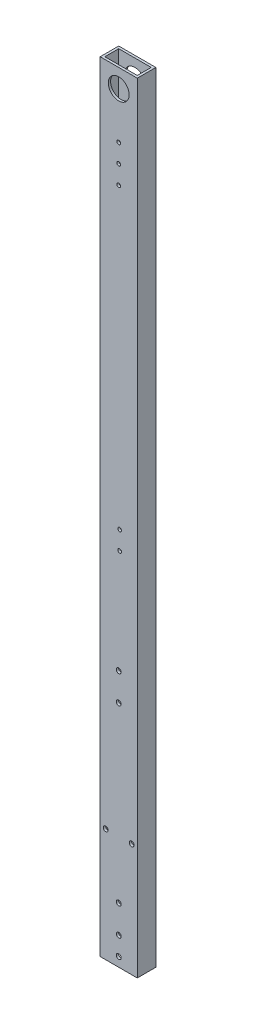
ISO-10303-21;
HEADER;
FILE_DESCRIPTION(('STEP AP214'),'2;1');
FILE_NAME('part.step','',(''),(''),'','','');
FILE_SCHEMA(('AUTOMOTIVE_DESIGN { 1 0 10303 214 1 1 1 1 }'));
ENDSEC;
DATA;
#1=APPLICATION_CONTEXT('core data for automotive mechanical design processes');
#2=APPLICATION_PROTOCOL_DEFINITION('international standard','automotive_design',2000,#1);
#3=PRODUCT_CONTEXT('',#1,'mechanical');
#4=PRODUCT('Part','Part','',(#3));
#5=PRODUCT_RELATED_PRODUCT_CATEGORY('part','',(#4));
#6=PRODUCT_DEFINITION_FORMATION('','',#4);
#7=PRODUCT_DEFINITION_CONTEXT('part definition',#1,'design');
#8=PRODUCT_DEFINITION('design','',#6,#7);
#9=PRODUCT_DEFINITION_SHAPE('','',#8);
#10=(LENGTH_UNIT() NAMED_UNIT(*) SI_UNIT(.MILLI.,.METRE.));
#11=(NAMED_UNIT(*) PLANE_ANGLE_UNIT() SI_UNIT($,.RADIAN.));
#12=(NAMED_UNIT(*) SI_UNIT($,.STERADIAN.) SOLID_ANGLE_UNIT());
#13=UNCERTAINTY_MEASURE_WITH_UNIT(LENGTH_MEASURE(1.E-05),#10,'distance_accuracy_value','');
#14=(GEOMETRIC_REPRESENTATION_CONTEXT(3) GLOBAL_UNCERTAINTY_ASSIGNED_CONTEXT((#13)) GLOBAL_UNIT_ASSIGNED_CONTEXT((#10,
#11,#12)) REPRESENTATION_CONTEXT('',''));
#15=CARTESIAN_POINT('',(0.,0.,0.));
#16=DIRECTION('',(0.,0.,1.));
#17=DIRECTION('',(1.,0.,0.));
#18=AXIS2_PLACEMENT_3D('',#15,#16,#17);
#19=CARTESIAN_POINT('',(0.,1066.8,0.));
#20=DIRECTION('',(0.,-1.,0.));
#21=DIRECTION('',(0.,0.,-1.));
#22=AXIS2_PLACEMENT_3D('',#19,#20,#21);
#23=PLANE('',#22);
#24=DIRECTION('',(0.,0.,-1.));
#25=VECTOR('',#24,1.);
#26=CARTESIAN_POINT('',(25.4,1066.8,12.7));
#27=LINE('',#26,#25);
#28=CARTESIAN_POINT('',(25.4,1066.8,12.7));
#29=VERTEX_POINT('',#28);
#30=CARTESIAN_POINT('',(25.4,1066.8,-12.7));
#31=VERTEX_POINT('',#30);
#32=EDGE_CURVE('E137',#29,#31,#27,.T.);
#33=ORIENTED_EDGE('',*,*,#32,.T.);
#34=DIRECTION('',(-1.,0.,0.));
#35=VECTOR('',#34,1.);
#36=CARTESIAN_POINT('',(-25.4,1066.8,-12.7));
#37=LINE('',#36,#35);
#38=CARTESIAN_POINT('',(-25.4,1066.8,-12.7));
#39=VERTEX_POINT('',#38);
#40=EDGE_CURVE('E140',#31,#39,#37,.T.);
#41=ORIENTED_EDGE('',*,*,#40,.T.);
#42=DIRECTION('',(0.,0.,1.));
#43=VECTOR('',#42,1.);
#44=CARTESIAN_POINT('',(-25.4,1066.8,12.7));
#45=LINE('',#44,#43);
#46=CARTESIAN_POINT('',(-25.4,1066.8,12.7));
#47=VERTEX_POINT('',#46);
#48=EDGE_CURVE('E143',#39,#47,#45,.T.);
#49=ORIENTED_EDGE('',*,*,#48,.T.);
#50=DIRECTION('',(1.,0.,0.));
#51=VECTOR('',#50,1.);
#52=CARTESIAN_POINT('',(-25.4,1066.8,12.7));
#53=LINE('',#52,#51);
#54=EDGE_CURVE('E145',#47,#29,#53,.T.);
#55=ORIENTED_EDGE('',*,*,#54,.T.);
#56=EDGE_LOOP('',(#33,#41,#49,#55));
#57=FACE_BOUND('',#56,.T.);
#58=DIRECTION('',(0.,0.,1.));
#59=VECTOR('',#58,1.);
#60=CARTESIAN_POINT('',(-22.225,1066.8,9.525));
#61=LINE('',#60,#59);
#62=CARTESIAN_POINT('',(-22.225,1066.8,-9.525));
#63=VERTEX_POINT('',#62);
#64=CARTESIAN_POINT('',(-22.225,1066.8,9.525));
#65=VERTEX_POINT('',#64);
#66=EDGE_CURVE('E99',#63,#65,#61,.T.);
#67=ORIENTED_EDGE('',*,*,#66,.F.);
#68=DIRECTION('',(-1.,0.,0.));
#69=VECTOR('',#68,1.);
#70=CARTESIAN_POINT('',(-22.225,1066.8,-9.525));
#71=LINE('',#70,#69);
#72=CARTESIAN_POINT('',(22.225,1066.8,-9.525));
#73=VERTEX_POINT('',#72);
#74=EDGE_CURVE('E121',#73,#63,#71,.T.);
#75=ORIENTED_EDGE('',*,*,#74,.F.);
#76=DIRECTION('',(0.,0.,-1.));
#77=VECTOR('',#76,1.);
#78=CARTESIAN_POINT('',(22.225,1066.8,9.525));
#79=LINE('',#78,#77);
#80=CARTESIAN_POINT('',(22.225,1066.8,9.525));
#81=VERTEX_POINT('',#80);
#82=EDGE_CURVE('E119',#81,#73,#79,.T.);
#83=ORIENTED_EDGE('',*,*,#82,.F.);
#84=DIRECTION('',(1.,0.,0.));
#85=VECTOR('',#84,1.);
#86=CARTESIAN_POINT('',(-22.225,1066.8,9.525));
#87=LINE('',#86,#85);
#88=EDGE_CURVE('E107',#65,#81,#87,.T.);
#89=ORIENTED_EDGE('',*,*,#88,.F.);
#90=EDGE_LOOP('',(#67,#75,#83,#89));
#91=FACE_BOUND('',#90,.T.);
#92=ADVANCED_FACE('F32',(#57,#91),#23,.F.);
#93=CARTESIAN_POINT('',(0.,0.,0.));
#94=DIRECTION('',(0.,-1.,0.));
#95=DIRECTION('',(0.,0.,-1.));
#96=AXIS2_PLACEMENT_3D('',#93,#94,#95);
#97=PLANE('',#96);
#98=DIRECTION('',(0.,0.,-1.));
#99=VECTOR('',#98,1.);
#100=CARTESIAN_POINT('',(25.4,0.,12.7));
#101=LINE('',#100,#99);
#102=CARTESIAN_POINT('',(25.4,0.,12.7));
#103=VERTEX_POINT('',#102);
#104=CARTESIAN_POINT('',(25.4,0.,-12.7));
#105=VERTEX_POINT('',#104);
#106=EDGE_CURVE('E115',#103,#105,#101,.T.);
#107=ORIENTED_EDGE('',*,*,#106,.F.);
#108=DIRECTION('',(1.,0.,0.));
#109=VECTOR('',#108,1.);
#110=CARTESIAN_POINT('',(-25.4,0.,12.7));
#111=LINE('',#110,#109);
#112=CARTESIAN_POINT('',(-25.4,0.,12.7));
#113=VERTEX_POINT('',#112);
#114=EDGE_CURVE('E141',#113,#103,#111,.T.);
#115=ORIENTED_EDGE('',*,*,#114,.F.);
#116=DIRECTION('',(0.,0.,1.));
#117=VECTOR('',#116,1.);
#118=CARTESIAN_POINT('',(-25.4,0.,12.7));
#119=LINE('',#118,#117);
#120=CARTESIAN_POINT('',(-25.4,0.,-12.7));
#121=VERTEX_POINT('',#120);
#122=EDGE_CURVE('E152',#121,#113,#119,.T.);
#123=ORIENTED_EDGE('',*,*,#122,.F.);
#124=DIRECTION('',(-1.,0.,0.));
#125=VECTOR('',#124,1.);
#126=CARTESIAN_POINT('',(-25.4,0.,-12.7));
#127=LINE('',#126,#125);
#128=EDGE_CURVE('E150',#105,#121,#127,.T.);
#129=ORIENTED_EDGE('',*,*,#128,.F.);
#130=EDGE_LOOP('',(#107,#115,#123,#129));
#131=FACE_BOUND('',#130,.T.);
#132=DIRECTION('',(-1.,0.,0.));
#133=VECTOR('',#132,1.);
#134=CARTESIAN_POINT('',(-22.225,0.,-9.525));
#135=LINE('',#134,#133);
#136=CARTESIAN_POINT('',(22.225,0.,-9.525));
#137=VERTEX_POINT('',#136);
#138=CARTESIAN_POINT('',(-22.225,0.,-9.525));
#139=VERTEX_POINT('',#138);
#140=EDGE_CURVE('E108',#137,#139,#135,.T.);
#141=ORIENTED_EDGE('',*,*,#140,.T.);
#142=DIRECTION('',(0.,0.,1.));
#143=VECTOR('',#142,1.);
#144=CARTESIAN_POINT('',(-22.225,0.,9.525));
#145=LINE('',#144,#143);
#146=CARTESIAN_POINT('',(-22.225,0.,9.525));
#147=VERTEX_POINT('',#146);
#148=EDGE_CURVE('E57',#139,#147,#145,.T.);
#149=ORIENTED_EDGE('',*,*,#148,.T.);
#150=DIRECTION('',(1.,0.,0.));
#151=VECTOR('',#150,1.);
#152=CARTESIAN_POINT('',(-22.225,0.,9.525));
#153=LINE('',#152,#151);
#154=CARTESIAN_POINT('',(22.225,0.,9.525));
#155=VERTEX_POINT('',#154);
#156=EDGE_CURVE('E114',#147,#155,#153,.T.);
#157=ORIENTED_EDGE('',*,*,#156,.T.);
#158=DIRECTION('',(0.,0.,-1.));
#159=VECTOR('',#158,1.);
#160=CARTESIAN_POINT('',(22.225,0.,9.525));
#161=LINE('',#160,#159);
#162=EDGE_CURVE('E129',#155,#137,#161,.T.);
#163=ORIENTED_EDGE('',*,*,#162,.T.);
#164=EDGE_LOOP('',(#141,#149,#157,#163));
#165=FACE_BOUND('',#164,.T.);
#166=ADVANCED_FACE('F330',(#131,#165),#97,.T.);
#167=CARTESIAN_POINT('',(25.4,1066.8,12.7));
#168=DIRECTION('',(-1.,0.,0.));
#169=DIRECTION('',(0.,0.,1.));
#170=AXIS2_PLACEMENT_3D('',#167,#168,#169);
#171=PLANE('',#170);
#172=ORIENTED_EDGE('',*,*,#106,.T.);
#173=DIRECTION('',(0.,-1.,0.));
#174=VECTOR('',#173,1.);
#175=CARTESIAN_POINT('',(25.4,1066.8,-12.7));
#176=LINE('',#175,#174);
#177=EDGE_CURVE('E11',#31,#105,#176,.T.);
#178=ORIENTED_EDGE('',*,*,#177,.F.);
#179=ORIENTED_EDGE('',*,*,#32,.F.);
#180=DIRECTION('',(0.,-1.,0.));
#181=VECTOR('',#180,1.);
#182=CARTESIAN_POINT('',(25.4,1066.8,12.7));
#183=LINE('',#182,#181);
#184=EDGE_CURVE('E147',#29,#103,#183,.T.);
#185=ORIENTED_EDGE('',*,*,#184,.T.);
#186=EDGE_LOOP('',(#172,#178,#179,#185));
#187=FACE_BOUND('',#186,.T.);
#188=ADVANCED_FACE('F34',(#187),#171,.F.);
#189=CARTESIAN_POINT('',(-25.4,1066.8,-12.7));
#190=DIRECTION('',(0.,0.,1.));
#191=DIRECTION('',(1.,0.,0.));
#192=AXIS2_PLACEMENT_3D('',#189,#190,#191);
#193=PLANE('',#192);
#194=CARTESIAN_POINT('',(-17.78000183893,155.17537,-12.7));
#195=DIRECTION('',(0.,0.,-1.));
#196=DIRECTION('',(-1.,0.,0.));
#197=AXIS2_PLACEMENT_3D('',#194,#195,#196);
#198=CIRCLE('',#197,3.37343749999999);
#199=CARTESIAN_POINT('',(-21.15343933893,155.17537,-12.7));
#200=VERTEX_POINT('',#199);
#201=EDGE_CURVE('E355',#200,#200,#198,.T.);
#202=ORIENTED_EDGE('',*,*,#201,.F.);
#203=EDGE_LOOP('',(#202));
#204=FACE_BOUND('',#203,.T.);
#205=CARTESIAN_POINT('',(17.77999816107,155.17537,-12.7));
#206=DIRECTION('',(0.,0.,-1.));
#207=DIRECTION('',(-1.,0.,0.));
#208=AXIS2_PLACEMENT_3D('',#205,#206,#207);
#209=CIRCLE('',#208,3.37343749999999);
#210=CARTESIAN_POINT('',(14.40656066107,155.17537,-12.7));
#211=VERTEX_POINT('',#210);
#212=EDGE_CURVE('E205',#211,#211,#209,.T.);
#213=ORIENTED_EDGE('',*,*,#212,.F.);
#214=EDGE_LOOP('',(#213));
#215=FACE_BOUND('',#214,.T.);
#216=CARTESIAN_POINT('',(0.,76.2,-12.7));
#217=DIRECTION('',(0.,0.,-1.));
#218=DIRECTION('',(-1.,0.,0.));
#219=AXIS2_PLACEMENT_3D('',#216,#217,#218);
#220=CIRCLE('',#219,3.3734375);
#221=CARTESIAN_POINT('',(-3.3734375,76.2,-12.7));
#222=VERTEX_POINT('',#221);
#223=EDGE_CURVE('E202',#222,#222,#220,.T.);
#224=ORIENTED_EDGE('',*,*,#223,.F.);
#225=EDGE_LOOP('',(#224));
#226=FACE_BOUND('',#225,.T.);
#227=CARTESIAN_POINT('',(3.04589686805912E-10,977.9,-12.7));
#228=DIRECTION('',(0.,0.,-1.));
#229=DIRECTION('',(-1.,0.,0.));
#230=AXIS2_PLACEMENT_3D('',#227,#228,#229);
#231=CIRCLE('',#230,2.57975099999999);
#232=CARTESIAN_POINT('',(-2.5797509996954,977.9,-12.7));
#233=VERTEX_POINT('',#232);
#234=EDGE_CURVE('E221',#233,#233,#231,.T.);
#235=ORIENTED_EDGE('',*,*,#234,.F.);
#236=EDGE_LOOP('',(#235));
#237=FACE_BOUND('',#236,.T.);
#238=CARTESIAN_POINT('',(3.49775763908156E-10,952.5,-12.7));
#239=DIRECTION('',(0.,0.,-1.));
#240=DIRECTION('',(-1.,0.,0.));
#241=AXIS2_PLACEMENT_3D('',#238,#239,#240);
#242=CIRCLE('',#241,2.57975099999999);
#243=CARTESIAN_POINT('',(-2.57975099965021,952.5,-12.7));
#244=VERTEX_POINT('',#243);
#245=EDGE_CURVE('E228',#244,#244,#242,.T.);
#246=ORIENTED_EDGE('',*,*,#245,.F.);
#247=EDGE_LOOP('',(#246));
#248=FACE_BOUND('',#247,.T.);
#249=CARTESIAN_POINT('',(3.04589686805912E-10,927.1,-12.7));
#250=DIRECTION('',(0.,0.,-1.));
#251=DIRECTION('',(-1.,0.,0.));
#252=AXIS2_PLACEMENT_3D('',#249,#250,#251);
#253=CIRCLE('',#252,2.57975099999999);
#254=CARTESIAN_POINT('',(-2.5797509996954,927.1,-12.7));
#255=VERTEX_POINT('',#254);
#256=EDGE_CURVE('E240',#255,#255,#253,.T.);
#257=ORIENTED_EDGE('',*,*,#256,.F.);
#258=EDGE_LOOP('',(#257));
#259=FACE_BOUND('',#258,.T.);
#260=CARTESIAN_POINT('',(1.26999999924999,519.585439926844,-12.7));
#261=DIRECTION('',(0.,0.,-1.));
#262=DIRECTION('',(-1.,0.,0.));
#263=AXIS2_PLACEMENT_3D('',#260,#261,#262);
#264=CIRCLE('',#263,2.57975099999999);
#265=CARTESIAN_POINT('',(-1.30975100074999,519.585439926844,-12.7));
#266=VERTEX_POINT('',#265);
#267=EDGE_CURVE('E252',#266,#266,#264,.T.);
#268=ORIENTED_EDGE('',*,*,#267,.F.);
#269=EDGE_LOOP('',(#268));
#270=FACE_BOUND('',#269,.T.);
#271=CARTESIAN_POINT('',(1.26999999925047,494.185439926844,-12.7));
#272=DIRECTION('',(0.,0.,-1.));
#273=DIRECTION('',(-1.,0.,0.));
#274=AXIS2_PLACEMENT_3D('',#271,#272,#273);
#275=CIRCLE('',#274,2.57975099999999);
#276=CARTESIAN_POINT('',(-1.30975100074952,494.185439926844,-12.7));
#277=VERTEX_POINT('',#276);
#278=EDGE_CURVE('E264',#277,#277,#275,.T.);
#279=ORIENTED_EDGE('',*,*,#278,.F.);
#280=EDGE_LOOP('',(#279));
#281=FACE_BOUND('',#280,.T.);
#282=CARTESIAN_POINT('',(0.,38.1,-12.7));
#283=DIRECTION('',(0.,0.,1.));
#284=DIRECTION('',(1.,0.,0.));
#285=AXIS2_PLACEMENT_3D('',#282,#283,#284);
#286=CIRCLE('',#285,3.3734375);
#287=CARTESIAN_POINT('',(3.3734375,38.1,-12.7));
#288=VERTEX_POINT('',#287);
#289=EDGE_CURVE('E185',#288,#288,#286,.T.);
#290=ORIENTED_EDGE('',*,*,#289,.T.);
#291=EDGE_LOOP('',(#290));
#292=FACE_BOUND('',#291,.T.);
#293=CARTESIAN_POINT('',(0.,12.7,-12.7));
#294=DIRECTION('',(0.,0.,1.));
#295=DIRECTION('',(1.,0.,0.));
#296=AXIS2_PLACEMENT_3D('',#293,#294,#295);
#297=CIRCLE('',#296,3.3734375);
#298=CARTESIAN_POINT('',(3.3734375,12.7,-12.7));
#299=VERTEX_POINT('',#298);
#300=EDGE_CURVE('E180',#299,#299,#297,.T.);
#301=ORIENTED_EDGE('',*,*,#300,.T.);
#302=EDGE_LOOP('',(#301));
#303=FACE_BOUND('',#302,.T.);
#304=CARTESIAN_POINT('',(0.,351.536,-12.7));
#305=DIRECTION('',(0.,0.,1.));
#306=DIRECTION('',(1.,0.,0.));
#307=AXIS2_PLACEMENT_3D('',#304,#305,#306);
#308=CIRCLE('',#307,3.37343750000001);
#309=CARTESIAN_POINT('',(3.37343750000001,351.536,-12.7));
#310=VERTEX_POINT('',#309);
#311=EDGE_CURVE('E175',#310,#310,#308,.T.);
#312=ORIENTED_EDGE('',*,*,#311,.T.);
#313=EDGE_LOOP('',(#312));
#314=FACE_BOUND('',#313,.T.);
#315=CARTESIAN_POINT('',(0.,313.436,-12.7));
#316=DIRECTION('',(0.,0.,1.));
#317=DIRECTION('',(1.,0.,0.));
#318=AXIS2_PLACEMENT_3D('',#315,#316,#317);
#319=CIRCLE('',#318,3.37343750000001);
#320=CARTESIAN_POINT('',(3.37343750000001,313.436,-12.7));
#321=VERTEX_POINT('',#320);
#322=EDGE_CURVE('E170',#321,#321,#319,.T.);
#323=ORIENTED_EDGE('',*,*,#322,.T.);
#324=EDGE_LOOP('',(#323));
#325=FACE_BOUND('',#324,.T.);
#326=CARTESIAN_POINT('',(0.,1041.4,-12.7));
#327=DIRECTION('',(0.,0.,1.));
#328=DIRECTION('',(1.,0.,0.));
#329=AXIS2_PLACEMENT_3D('',#326,#327,#328);
#330=CIRCLE('',#329,14.2875);
#331=CARTESIAN_POINT('',(14.2875,1041.4,-12.7));
#332=VERTEX_POINT('',#331);
#333=EDGE_CURVE('E165',#332,#332,#330,.T.);
#334=ORIENTED_EDGE('',*,*,#333,.T.);
#335=EDGE_LOOP('',(#334));
#336=FACE_BOUND('',#335,.T.);
#337=ORIENTED_EDGE('',*,*,#128,.T.);
#338=DIRECTION('',(0.,-1.,0.));
#339=VECTOR('',#338,1.);
#340=CARTESIAN_POINT('',(-25.4,1066.8,-12.7));
#341=LINE('',#340,#339);
#342=EDGE_CURVE('E41',#39,#121,#341,.T.);
#343=ORIENTED_EDGE('',*,*,#342,.F.);
#344=ORIENTED_EDGE('',*,*,#40,.F.);
#345=ORIENTED_EDGE('',*,*,#177,.T.);
#346=EDGE_LOOP('',(#337,#343,#344,#345));
#347=FACE_BOUND('',#346,.T.);
#348=ADVANCED_FACE('F344',(#204,#215,#226,#237,#248,#259,#270,#281,#292,#303,#314,#325,#336,
#347),#193,.F.);
#349=CARTESIAN_POINT('',(-25.4,1066.8,12.7));
#350=DIRECTION('',(1.,0.,0.));
#351=DIRECTION('',(0.,0.,-1.));
#352=AXIS2_PLACEMENT_3D('',#349,#350,#351);
#353=PLANE('',#352);
#354=ORIENTED_EDGE('',*,*,#122,.T.);
#355=DIRECTION('',(0.,-1.,0.));
#356=VECTOR('',#355,1.);
#357=CARTESIAN_POINT('',(-25.4,1066.8,12.7));
#358=LINE('',#357,#356);
#359=EDGE_CURVE('E157',#47,#113,#358,.T.);
#360=ORIENTED_EDGE('',*,*,#359,.F.);
#361=ORIENTED_EDGE('',*,*,#48,.F.);
#362=ORIENTED_EDGE('',*,*,#342,.T.);
#363=EDGE_LOOP('',(#354,#360,#361,#362));
#364=FACE_BOUND('',#363,.T.);
#365=ADVANCED_FACE('F341',(#364),#353,.F.);
#366=CARTESIAN_POINT('',(-25.4,1066.8,12.7));
#367=DIRECTION('',(0.,0.,-1.));
#368=DIRECTION('',(-1.,0.,0.));
#369=AXIS2_PLACEMENT_3D('',#366,#367,#368);
#370=PLANE('',#369);
#371=CARTESIAN_POINT('',(-17.78000183893,155.17537,12.7));
#372=DIRECTION('',(0.,0.,-1.));
#373=DIRECTION('',(-1.,0.,0.));
#374=AXIS2_PLACEMENT_3D('',#371,#372,#373);
#375=CIRCLE('',#374,3.37343749999999);
#376=CARTESIAN_POINT('',(-21.15343933893,155.17537,12.7));
#377=VERTEX_POINT('',#376);
#378=EDGE_CURVE('E471',#377,#377,#375,.T.);
#379=ORIENTED_EDGE('',*,*,#378,.T.);
#380=EDGE_LOOP('',(#379));
#381=FACE_BOUND('',#380,.T.);
#382=CARTESIAN_POINT('',(17.77999816107,155.17537,12.7));
#383=DIRECTION('',(0.,0.,-1.));
#384=DIRECTION('',(-1.,0.,0.));
#385=AXIS2_PLACEMENT_3D('',#382,#383,#384);
#386=CIRCLE('',#385,3.37343749999999);
#387=CARTESIAN_POINT('',(14.40656066107,155.17537,12.7));
#388=VERTEX_POINT('',#387);
#389=EDGE_CURVE('E198',#388,#388,#386,.T.);
#390=ORIENTED_EDGE('',*,*,#389,.T.);
#391=EDGE_LOOP('',(#390));
#392=FACE_BOUND('',#391,.T.);
#393=CARTESIAN_POINT('',(0.,76.2,12.7));
#394=DIRECTION('',(0.,0.,-1.));
#395=DIRECTION('',(-1.,0.,0.));
#396=AXIS2_PLACEMENT_3D('',#393,#394,#395);
#397=CIRCLE('',#396,3.3734375);
#398=CARTESIAN_POINT('',(-3.3734375,76.2,12.7));
#399=VERTEX_POINT('',#398);
#400=EDGE_CURVE('E194',#399,#399,#397,.T.);
#401=ORIENTED_EDGE('',*,*,#400,.T.);
#402=EDGE_LOOP('',(#401));
#403=FACE_BOUND('',#402,.T.);
#404=CARTESIAN_POINT('',(3.04589686805912E-10,977.9,12.7));
#405=DIRECTION('',(0.,0.,-1.));
#406=DIRECTION('',(-1.,0.,0.));
#407=AXIS2_PLACEMENT_3D('',#404,#405,#406);
#408=CIRCLE('',#407,2.57975099999999);
#409=CARTESIAN_POINT('',(-2.5797509996954,977.9,12.7));
#410=VERTEX_POINT('',#409);
#411=EDGE_CURVE('E190',#410,#410,#408,.T.);
#412=ORIENTED_EDGE('',*,*,#411,.T.);
#413=EDGE_LOOP('',(#412));
#414=FACE_BOUND('',#413,.T.);
#415=CARTESIAN_POINT('',(3.49775763908156E-10,952.5,12.7));
#416=DIRECTION('',(0.,0.,-1.));
#417=DIRECTION('',(-1.,0.,0.));
#418=AXIS2_PLACEMENT_3D('',#415,#416,#417);
#419=CIRCLE('',#418,2.57975099999999);
#420=CARTESIAN_POINT('',(-2.57975099965021,952.5,12.7));
#421=VERTEX_POINT('',#420);
#422=EDGE_CURVE('E231',#421,#421,#419,.T.);
#423=ORIENTED_EDGE('',*,*,#422,.T.);
#424=EDGE_LOOP('',(#423));
#425=FACE_BOUND('',#424,.T.);
#426=CARTESIAN_POINT('',(3.04589686805912E-10,927.1,12.7));
#427=DIRECTION('',(0.,0.,-1.));
#428=DIRECTION('',(-1.,0.,0.));
#429=AXIS2_PLACEMENT_3D('',#426,#427,#428);
#430=CIRCLE('',#429,2.57975099999999);
#431=CARTESIAN_POINT('',(-2.5797509996954,927.1,12.7));
#432=VERTEX_POINT('',#431);
#433=EDGE_CURVE('E243',#432,#432,#430,.T.);
#434=ORIENTED_EDGE('',*,*,#433,.T.);
#435=EDGE_LOOP('',(#434));
#436=FACE_BOUND('',#435,.T.);
#437=CARTESIAN_POINT('',(1.26999999924999,519.585439926844,12.7));
#438=DIRECTION('',(0.,0.,-1.));
#439=DIRECTION('',(-1.,0.,0.));
#440=AXIS2_PLACEMENT_3D('',#437,#438,#439);
#441=CIRCLE('',#440,2.57975099999998);
#442=CARTESIAN_POINT('',(-1.30975100074999,519.585439926844,12.7));
#443=VERTEX_POINT('',#442);
#444=EDGE_CURVE('E255',#443,#443,#441,.T.);
#445=ORIENTED_EDGE('',*,*,#444,.T.);
#446=EDGE_LOOP('',(#445));
#447=FACE_BOUND('',#446,.T.);
#448=CARTESIAN_POINT('',(1.26999999925047,494.185439926844,12.7));
#449=DIRECTION('',(0.,0.,-1.));
#450=DIRECTION('',(-1.,0.,0.));
#451=AXIS2_PLACEMENT_3D('',#448,#449,#450);
#452=CIRCLE('',#451,2.57975099999998);
#453=CARTESIAN_POINT('',(-1.30975100074952,494.185439926844,12.7));
#454=VERTEX_POINT('',#453);
#455=EDGE_CURVE('E267',#454,#454,#452,.T.);
#456=ORIENTED_EDGE('',*,*,#455,.T.);
#457=EDGE_LOOP('',(#456));
#458=FACE_BOUND('',#457,.T.);
#459=CARTESIAN_POINT('',(0.,38.1,12.7));
#460=DIRECTION('',(0.,0.,1.));
#461=DIRECTION('',(1.,0.,0.));
#462=AXIS2_PLACEMENT_3D('',#459,#460,#461);
#463=CIRCLE('',#462,3.3734375);
#464=CARTESIAN_POINT('',(3.3734375,38.1,12.7));
#465=VERTEX_POINT('',#464);
#466=EDGE_CURVE('E276',#465,#465,#463,.T.);
#467=ORIENTED_EDGE('',*,*,#466,.F.);
#468=EDGE_LOOP('',(#467));
#469=FACE_BOUND('',#468,.T.);
#470=CARTESIAN_POINT('',(0.,12.7,12.7));
#471=DIRECTION('',(0.,0.,1.));
#472=DIRECTION('',(1.,0.,0.));
#473=AXIS2_PLACEMENT_3D('',#470,#471,#472);
#474=CIRCLE('',#473,3.3734375);
#475=CARTESIAN_POINT('',(3.3734375,12.7,12.7));
#476=VERTEX_POINT('',#475);
#477=EDGE_CURVE('E283',#476,#476,#474,.T.);
#478=ORIENTED_EDGE('',*,*,#477,.F.);
#479=EDGE_LOOP('',(#478));
#480=FACE_BOUND('',#479,.T.);
#481=CARTESIAN_POINT('',(0.,351.536,12.7));
#482=DIRECTION('',(0.,0.,1.));
#483=DIRECTION('',(1.,0.,0.));
#484=AXIS2_PLACEMENT_3D('',#481,#482,#483);
#485=CIRCLE('',#484,3.37343750000001);
#486=CARTESIAN_POINT('',(3.37343750000001,351.536,12.7));
#487=VERTEX_POINT('',#486);
#488=EDGE_CURVE('E290',#487,#487,#485,.T.);
#489=ORIENTED_EDGE('',*,*,#488,.F.);
#490=EDGE_LOOP('',(#489));
#491=FACE_BOUND('',#490,.T.);
#492=CARTESIAN_POINT('',(0.,313.436,12.7));
#493=DIRECTION('',(0.,0.,1.));
#494=DIRECTION('',(1.,0.,0.));
#495=AXIS2_PLACEMENT_3D('',#492,#493,#494);
#496=CIRCLE('',#495,3.37343750000001);
#497=CARTESIAN_POINT('',(3.37343750000001,313.436,12.7));
#498=VERTEX_POINT('',#497);
#499=EDGE_CURVE('E297',#498,#498,#496,.T.);
#500=ORIENTED_EDGE('',*,*,#499,.F.);
#501=EDGE_LOOP('',(#500));
#502=FACE_BOUND('',#501,.T.);
#503=CARTESIAN_POINT('',(0.,1041.4,12.7));
#504=DIRECTION('',(0.,0.,1.));
#505=DIRECTION('',(1.,0.,0.));
#506=AXIS2_PLACEMENT_3D('',#503,#504,#505);
#507=CIRCLE('',#506,14.2875);
#508=CARTESIAN_POINT('',(14.2875,1041.4,12.7));
#509=VERTEX_POINT('',#508);
#510=EDGE_CURVE('E304',#509,#509,#507,.T.);
#511=ORIENTED_EDGE('',*,*,#510,.F.);
#512=EDGE_LOOP('',(#511));
#513=FACE_BOUND('',#512,.T.);
#514=ORIENTED_EDGE('',*,*,#114,.T.);
#515=ORIENTED_EDGE('',*,*,#184,.F.);
#516=ORIENTED_EDGE('',*,*,#54,.F.);
#517=ORIENTED_EDGE('',*,*,#359,.T.);
#518=EDGE_LOOP('',(#514,#515,#516,#517));
#519=FACE_BOUND('',#518,.T.);
#520=ADVANCED_FACE('F325',(#381,#392,#403,#414,#425,#436,#447,#458,#469,#480,#491,#502,#513,
#519),#370,.F.);
#521=CARTESIAN_POINT('',(-22.225,1066.8,9.525));
#522=DIRECTION('',(1.,0.,0.));
#523=DIRECTION('',(0.,0.,-1.));
#524=AXIS2_PLACEMENT_3D('',#521,#522,#523);
#525=PLANE('',#524);
#526=ORIENTED_EDGE('',*,*,#148,.F.);
#527=DIRECTION('',(0.,-1.,0.));
#528=VECTOR('',#527,1.);
#529=CARTESIAN_POINT('',(-22.225,1066.8,-9.525));
#530=LINE('',#529,#528);
#531=EDGE_CURVE('E103',#63,#139,#530,.T.);
#532=ORIENTED_EDGE('',*,*,#531,.F.);
#533=ORIENTED_EDGE('',*,*,#66,.T.);
#534=DIRECTION('',(0.,-1.,0.));
#535=VECTOR('',#534,1.);
#536=CARTESIAN_POINT('',(-22.225,1066.8,9.525));
#537=LINE('',#536,#535);
#538=EDGE_CURVE('E102',#65,#147,#537,.T.);
#539=ORIENTED_EDGE('',*,*,#538,.T.);
#540=EDGE_LOOP('',(#526,#532,#533,#539));
#541=FACE_BOUND('',#540,.T.);
#542=ADVANCED_FACE('F101',(#541),#525,.T.);
#543=CARTESIAN_POINT('',(-22.225,1066.8,9.525));
#544=DIRECTION('',(0.,0.,-1.));
#545=DIRECTION('',(-1.,0.,0.));
#546=AXIS2_PLACEMENT_3D('',#543,#544,#545);
#547=PLANE('',#546);
#548=CARTESIAN_POINT('',(-17.78000183893,155.17537,9.525));
#549=DIRECTION('',(0.,0.,-1.));
#550=DIRECTION('',(-1.,0.,0.));
#551=AXIS2_PLACEMENT_3D('',#548,#549,#550);
#552=CIRCLE('',#551,3.37343749999999);
#553=CARTESIAN_POINT('',(-21.15343933893,155.17537,9.525));
#554=VERTEX_POINT('',#553);
#555=EDGE_CURVE('E210',#554,#554,#552,.T.);
#556=ORIENTED_EDGE('',*,*,#555,.F.);
#557=EDGE_LOOP('',(#556));
#558=FACE_BOUND('',#557,.T.);
#559=CARTESIAN_POINT('',(17.77999816107,155.17537,9.525));
#560=DIRECTION('',(0.,0.,-1.));
#561=DIRECTION('',(-1.,0.,0.));
#562=AXIS2_PLACEMENT_3D('',#559,#560,#561);
#563=CIRCLE('',#562,3.37343749999999);
#564=CARTESIAN_POINT('',(14.40656066107,155.17537,9.525));
#565=VERTEX_POINT('',#564);
#566=EDGE_CURVE('E197',#565,#565,#563,.T.);
#567=ORIENTED_EDGE('',*,*,#566,.F.);
#568=EDGE_LOOP('',(#567));
#569=FACE_BOUND('',#568,.T.);
#570=CARTESIAN_POINT('',(0.,76.2,9.525));
#571=DIRECTION('',(0.,0.,-1.));
#572=DIRECTION('',(-1.,0.,0.));
#573=AXIS2_PLACEMENT_3D('',#570,#571,#572);
#574=CIRCLE('',#573,3.3734375);
#575=CARTESIAN_POINT('',(-3.3734375,76.2,9.525));
#576=VERTEX_POINT('',#575);
#577=EDGE_CURVE('E193',#576,#576,#574,.T.);
#578=ORIENTED_EDGE('',*,*,#577,.F.);
#579=EDGE_LOOP('',(#578));
#580=FACE_BOUND('',#579,.T.);
#581=CARTESIAN_POINT('',(3.04589686805912E-10,977.9,9.525));
#582=DIRECTION('',(0.,0.,-1.));
#583=DIRECTION('',(-1.,0.,0.));
#584=AXIS2_PLACEMENT_3D('',#581,#582,#583);
#585=CIRCLE('',#584,2.57975099999999);
#586=CARTESIAN_POINT('',(-2.5797509996954,977.9,9.525));
#587=VERTEX_POINT('',#586);
#588=EDGE_CURVE('E189',#587,#587,#585,.T.);
#589=ORIENTED_EDGE('',*,*,#588,.F.);
#590=EDGE_LOOP('',(#589));
#591=FACE_BOUND('',#590,.T.);
#592=CARTESIAN_POINT('',(3.49775763908156E-10,952.5,9.525));
#593=DIRECTION('',(0.,0.,-1.));
#594=DIRECTION('',(-1.,0.,0.));
#595=AXIS2_PLACEMENT_3D('',#592,#593,#594);
#596=CIRCLE('',#595,2.57975099999999);
#597=CARTESIAN_POINT('',(-2.57975099965021,952.5,9.525));
#598=VERTEX_POINT('',#597);
#599=EDGE_CURVE('E237',#598,#598,#596,.T.);
#600=ORIENTED_EDGE('',*,*,#599,.F.);
#601=EDGE_LOOP('',(#600));
#602=FACE_BOUND('',#601,.T.);
#603=CARTESIAN_POINT('',(3.04589686805912E-10,927.1,9.525));
#604=DIRECTION('',(0.,0.,-1.));
#605=DIRECTION('',(-1.,0.,0.));
#606=AXIS2_PLACEMENT_3D('',#603,#604,#605);
#607=CIRCLE('',#606,2.57975099999999);
#608=CARTESIAN_POINT('',(-2.5797509996954,927.1,9.525));
#609=VERTEX_POINT('',#608);
#610=EDGE_CURVE('E246',#609,#609,#607,.T.);
#611=ORIENTED_EDGE('',*,*,#610,.F.);
#612=EDGE_LOOP('',(#611));
#613=FACE_BOUND('',#612,.T.);
#614=CARTESIAN_POINT('',(1.26999999924999,519.585439926844,9.525));
#615=DIRECTION('',(0.,0.,-1.));
#616=DIRECTION('',(-1.,0.,0.));
#617=AXIS2_PLACEMENT_3D('',#614,#615,#616);
#618=CIRCLE('',#617,2.57975099999999);
#619=CARTESIAN_POINT('',(-1.30975100074999,519.585439926844,9.525));
#620=VERTEX_POINT('',#619);
#621=EDGE_CURVE('E261',#620,#620,#618,.T.);
#622=ORIENTED_EDGE('',*,*,#621,.F.);
#623=EDGE_LOOP('',(#622));
#624=FACE_BOUND('',#623,.T.);
#625=CARTESIAN_POINT('',(1.26999999925047,494.185439926844,9.525));
#626=DIRECTION('',(0.,0.,-1.));
#627=DIRECTION('',(-1.,0.,0.));
#628=AXIS2_PLACEMENT_3D('',#625,#626,#627);
#629=CIRCLE('',#628,2.57975099999999);
#630=CARTESIAN_POINT('',(-1.30975100074952,494.185439926844,9.525));
#631=VERTEX_POINT('',#630);
#632=EDGE_CURVE('E273',#631,#631,#629,.T.);
#633=ORIENTED_EDGE('',*,*,#632,.F.);
#634=EDGE_LOOP('',(#633));
#635=FACE_BOUND('',#634,.T.);
#636=CARTESIAN_POINT('',(0.,38.1,9.525));
#637=DIRECTION('',(0.,0.,-1.));
#638=DIRECTION('',(-1.,0.,0.));
#639=AXIS2_PLACEMENT_3D('',#636,#637,#638);
#640=CIRCLE('',#639,3.3734375);
#641=CARTESIAN_POINT('',(-3.3734375,38.1,9.525));
#642=VERTEX_POINT('',#641);
#643=EDGE_CURVE('E184',#642,#642,#640,.T.);
#644=ORIENTED_EDGE('',*,*,#643,.F.);
#645=EDGE_LOOP('',(#644));
#646=FACE_BOUND('',#645,.T.);
#647=CARTESIAN_POINT('',(0.,12.7,9.525));
#648=DIRECTION('',(0.,0.,-1.));
#649=DIRECTION('',(-1.,0.,0.));
#650=AXIS2_PLACEMENT_3D('',#647,#648,#649);
#651=CIRCLE('',#650,3.3734375);
#652=CARTESIAN_POINT('',(-3.3734375,12.7,9.525));
#653=VERTEX_POINT('',#652);
#654=EDGE_CURVE('E179',#653,#653,#651,.T.);
#655=ORIENTED_EDGE('',*,*,#654,.F.);
#656=EDGE_LOOP('',(#655));
#657=FACE_BOUND('',#656,.T.);
#658=CARTESIAN_POINT('',(0.,351.536,9.525));
#659=DIRECTION('',(0.,0.,-1.));
#660=DIRECTION('',(-1.,0.,0.));
#661=AXIS2_PLACEMENT_3D('',#658,#659,#660);
#662=CIRCLE('',#661,3.37343750000001);
#663=CARTESIAN_POINT('',(-3.3734375,351.536,9.525));
#664=VERTEX_POINT('',#663);
#665=EDGE_CURVE('E174',#664,#664,#662,.T.);
#666=ORIENTED_EDGE('',*,*,#665,.F.);
#667=EDGE_LOOP('',(#666));
#668=FACE_BOUND('',#667,.T.);
#669=CARTESIAN_POINT('',(0.,313.436,9.525));
#670=DIRECTION('',(0.,0.,-1.));
#671=DIRECTION('',(-1.,0.,0.));
#672=AXIS2_PLACEMENT_3D('',#669,#670,#671);
#673=CIRCLE('',#672,3.37343750000001);
#674=CARTESIAN_POINT('',(-3.3734375,313.436,9.525));
#675=VERTEX_POINT('',#674);
#676=EDGE_CURVE('E169',#675,#675,#673,.T.);
#677=ORIENTED_EDGE('',*,*,#676,.F.);
#678=EDGE_LOOP('',(#677));
#679=FACE_BOUND('',#678,.T.);
#680=CARTESIAN_POINT('',(0.,1041.4,9.525));
#681=DIRECTION('',(0.,0.,-1.));
#682=DIRECTION('',(-1.,0.,0.));
#683=AXIS2_PLACEMENT_3D('',#680,#681,#682);
#684=CIRCLE('',#683,14.2875);
#685=CARTESIAN_POINT('',(-14.2875,1041.4,9.525));
#686=VERTEX_POINT('',#685);
#687=EDGE_CURVE('E127',#686,#686,#684,.T.);
#688=ORIENTED_EDGE('',*,*,#687,.F.);
#689=EDGE_LOOP('',(#688));
#690=FACE_BOUND('',#689,.T.);
#691=ORIENTED_EDGE('',*,*,#156,.F.);
#692=ORIENTED_EDGE('',*,*,#538,.F.);
#693=ORIENTED_EDGE('',*,*,#88,.T.);
#694=DIRECTION('',(0.,-1.,0.));
#695=VECTOR('',#694,1.);
#696=CARTESIAN_POINT('',(22.225,1066.8,9.525));
#697=LINE('',#696,#695);
#698=EDGE_CURVE('E116',#81,#155,#697,.T.);
#699=ORIENTED_EDGE('',*,*,#698,.T.);
#700=EDGE_LOOP('',(#691,#692,#693,#699));
#701=FACE_BOUND('',#700,.T.);
#702=ADVANCED_FACE('F111',(#558,#569,#580,#591,#602,#613,#624,#635,#646,#657,#668,#679,#690,
#701),#547,.T.);
#703=CARTESIAN_POINT('',(22.225,1066.8,9.525));
#704=DIRECTION('',(-1.,0.,0.));
#705=DIRECTION('',(0.,0.,1.));
#706=AXIS2_PLACEMENT_3D('',#703,#704,#705);
#707=PLANE('',#706);
#708=ORIENTED_EDGE('',*,*,#162,.F.);
#709=ORIENTED_EDGE('',*,*,#698,.F.);
#710=ORIENTED_EDGE('',*,*,#82,.T.);
#711=DIRECTION('',(0.,-1.,0.));
#712=VECTOR('',#711,1.);
#713=CARTESIAN_POINT('',(22.225,1066.8,-9.525));
#714=LINE('',#713,#712);
#715=EDGE_CURVE('E49',#73,#137,#714,.T.);
#716=ORIENTED_EDGE('',*,*,#715,.T.);
#717=EDGE_LOOP('',(#708,#709,#710,#716));
#718=FACE_BOUND('',#717,.T.);
#719=ADVANCED_FACE('F315',(#718),#707,.T.);
#720=CARTESIAN_POINT('',(-22.225,1066.8,-9.525));
#721=DIRECTION('',(0.,0.,1.));
#722=DIRECTION('',(1.,0.,0.));
#723=AXIS2_PLACEMENT_3D('',#720,#721,#722);
#724=PLANE('',#723);
#725=CARTESIAN_POINT('',(-17.78000183893,155.17537,-9.525));
#726=DIRECTION('',(0.,0.,1.));
#727=DIRECTION('',(1.,0.,0.));
#728=AXIS2_PLACEMENT_3D('',#725,#726,#727);
#729=CIRCLE('',#728,3.37343749999999);
#730=CARTESIAN_POINT('',(-14.40656433893,155.17537,-9.525));
#731=VERTEX_POINT('',#730);
#732=EDGE_CURVE('E36',#731,#731,#729,.T.);
#733=ORIENTED_EDGE('',*,*,#732,.F.);
#734=EDGE_LOOP('',(#733));
#735=FACE_BOUND('',#734,.T.);
#736=CARTESIAN_POINT('',(17.77999816107,155.17537,-9.525));
#737=DIRECTION('',(0.,0.,1.));
#738=DIRECTION('',(1.,0.,0.));
#739=AXIS2_PLACEMENT_3D('',#736,#737,#738);
#740=CIRCLE('',#739,3.37343749999999);
#741=CARTESIAN_POINT('',(21.15343566107,155.17537,-9.525));
#742=VERTEX_POINT('',#741);
#743=EDGE_CURVE('E195',#742,#742,#740,.T.);
#744=ORIENTED_EDGE('',*,*,#743,.F.);
#745=EDGE_LOOP('',(#744));
#746=FACE_BOUND('',#745,.T.);
#747=CARTESIAN_POINT('',(0.,76.2,-9.525));
#748=DIRECTION('',(0.,0.,1.));
#749=DIRECTION('',(1.,0.,0.));
#750=AXIS2_PLACEMENT_3D('',#747,#748,#749);
#751=CIRCLE('',#750,3.3734375);
#752=CARTESIAN_POINT('',(3.3734375,76.2,-9.525));
#753=VERTEX_POINT('',#752);
#754=EDGE_CURVE('E191',#753,#753,#751,.T.);
#755=ORIENTED_EDGE('',*,*,#754,.F.);
#756=EDGE_LOOP('',(#755));
#757=FACE_BOUND('',#756,.T.);
#758=CARTESIAN_POINT('',(3.04589686805912E-10,977.9,-9.525));
#759=DIRECTION('',(0.,0.,1.));
#760=DIRECTION('',(1.,0.,0.));
#761=AXIS2_PLACEMENT_3D('',#758,#759,#760);
#762=CIRCLE('',#761,2.57975099999999);
#763=CARTESIAN_POINT('',(2.57975100030458,977.9,-9.525));
#764=VERTEX_POINT('',#763);
#765=EDGE_CURVE('E186',#764,#764,#762,.T.);
#766=ORIENTED_EDGE('',*,*,#765,.F.);
#767=EDGE_LOOP('',(#766));
#768=FACE_BOUND('',#767,.T.);
#769=CARTESIAN_POINT('',(3.49775763908156E-10,952.5,-9.525));
#770=DIRECTION('',(0.,0.,1.));
#771=DIRECTION('',(1.,0.,0.));
#772=AXIS2_PLACEMENT_3D('',#769,#770,#771);
#773=CIRCLE('',#772,2.57975099999999);
#774=CARTESIAN_POINT('',(2.57975100034976,952.5,-9.525));
#775=VERTEX_POINT('',#774);
#776=EDGE_CURVE('E234',#775,#775,#773,.T.);
#777=ORIENTED_EDGE('',*,*,#776,.F.);
#778=EDGE_LOOP('',(#777));
#779=FACE_BOUND('',#778,.T.);
#780=CARTESIAN_POINT('',(3.04589686805912E-10,927.1,-9.525));
#781=DIRECTION('',(0.,0.,1.));
#782=DIRECTION('',(1.,0.,0.));
#783=AXIS2_PLACEMENT_3D('',#780,#781,#782);
#784=CIRCLE('',#783,2.57975099999999);
#785=CARTESIAN_POINT('',(2.57975100030458,927.1,-9.525));
#786=VERTEX_POINT('',#785);
#787=EDGE_CURVE('E249',#786,#786,#784,.T.);
#788=ORIENTED_EDGE('',*,*,#787,.F.);
#789=EDGE_LOOP('',(#788));
#790=FACE_BOUND('',#789,.T.);
#791=CARTESIAN_POINT('',(1.26999999924999,519.585439926844,-9.525));
#792=DIRECTION('',(0.,0.,1.));
#793=DIRECTION('',(1.,0.,0.));
#794=AXIS2_PLACEMENT_3D('',#791,#792,#793);
#795=CIRCLE('',#794,2.57975099999999);
#796=CARTESIAN_POINT('',(3.84975099924998,519.585439926844,-9.525));
#797=VERTEX_POINT('',#796);
#798=EDGE_CURVE('E258',#797,#797,#795,.T.);
#799=ORIENTED_EDGE('',*,*,#798,.F.);
#800=EDGE_LOOP('',(#799));
#801=FACE_BOUND('',#800,.T.);
#802=CARTESIAN_POINT('',(1.26999999925047,494.185439926844,-9.525));
#803=DIRECTION('',(0.,0.,1.));
#804=DIRECTION('',(1.,0.,0.));
#805=AXIS2_PLACEMENT_3D('',#802,#803,#804);
#806=CIRCLE('',#805,2.57975099999999);
#807=CARTESIAN_POINT('',(3.84975099925045,494.185439926844,-9.525));
#808=VERTEX_POINT('',#807);
#809=EDGE_CURVE('E270',#808,#808,#806,.T.);
#810=ORIENTED_EDGE('',*,*,#809,.F.);
#811=EDGE_LOOP('',(#810));
#812=FACE_BOUND('',#811,.T.);
#813=CARTESIAN_POINT('',(0.,38.1,-9.525));
#814=DIRECTION('',(0.,0.,1.));
#815=DIRECTION('',(1.,0.,0.));
#816=AXIS2_PLACEMENT_3D('',#813,#814,#815);
#817=CIRCLE('',#816,3.3734375);
#818=CARTESIAN_POINT('',(3.3734375,38.1,-9.525));
#819=VERTEX_POINT('',#818);
#820=EDGE_CURVE('E181',#819,#819,#817,.T.);
#821=ORIENTED_EDGE('',*,*,#820,.F.);
#822=EDGE_LOOP('',(#821));
#823=FACE_BOUND('',#822,.T.);
#824=CARTESIAN_POINT('',(0.,12.7,-9.525));
#825=DIRECTION('',(0.,0.,1.));
#826=DIRECTION('',(1.,0.,0.));
#827=AXIS2_PLACEMENT_3D('',#824,#825,#826);
#828=CIRCLE('',#827,3.3734375);
#829=CARTESIAN_POINT('',(3.3734375,12.7,-9.525));
#830=VERTEX_POINT('',#829);
#831=EDGE_CURVE('E176',#830,#830,#828,.T.);
#832=ORIENTED_EDGE('',*,*,#831,.F.);
#833=EDGE_LOOP('',(#832));
#834=FACE_BOUND('',#833,.T.);
#835=CARTESIAN_POINT('',(0.,351.536,-9.525));
#836=DIRECTION('',(0.,0.,1.));
#837=DIRECTION('',(1.,0.,0.));
#838=AXIS2_PLACEMENT_3D('',#835,#836,#837);
#839=CIRCLE('',#838,3.37343750000001);
#840=CARTESIAN_POINT('',(3.37343750000001,351.536,-9.525));
#841=VERTEX_POINT('',#840);
#842=EDGE_CURVE('E171',#841,#841,#839,.T.);
#843=ORIENTED_EDGE('',*,*,#842,.F.);
#844=EDGE_LOOP('',(#843));
#845=FACE_BOUND('',#844,.T.);
#846=CARTESIAN_POINT('',(0.,313.436,-9.525));
#847=DIRECTION('',(0.,0.,1.));
#848=DIRECTION('',(1.,0.,0.));
#849=AXIS2_PLACEMENT_3D('',#846,#847,#848);
#850=CIRCLE('',#849,3.37343750000001);
#851=CARTESIAN_POINT('',(3.37343750000001,313.436,-9.525));
#852=VERTEX_POINT('',#851);
#853=EDGE_CURVE('E166',#852,#852,#850,.T.);
#854=ORIENTED_EDGE('',*,*,#853,.F.);
#855=EDGE_LOOP('',(#854));
#856=FACE_BOUND('',#855,.T.);
#857=CARTESIAN_POINT('',(0.,1041.4,-9.525));
#858=DIRECTION('',(0.,0.,1.));
#859=DIRECTION('',(1.,0.,0.));
#860=AXIS2_PLACEMENT_3D('',#857,#858,#859);
#861=CIRCLE('',#860,14.2875);
#862=CARTESIAN_POINT('',(14.2875,1041.4,-9.525));
#863=VERTEX_POINT('',#862);
#864=EDGE_CURVE('E162',#863,#863,#861,.T.);
#865=ORIENTED_EDGE('',*,*,#864,.F.);
#866=EDGE_LOOP('',(#865));
#867=FACE_BOUND('',#866,.T.);
#868=ORIENTED_EDGE('',*,*,#140,.F.);
#869=ORIENTED_EDGE('',*,*,#715,.F.);
#870=ORIENTED_EDGE('',*,*,#74,.T.);
#871=ORIENTED_EDGE('',*,*,#531,.T.);
#872=EDGE_LOOP('',(#868,#869,#870,#871));
#873=FACE_BOUND('',#872,.T.);
#874=ADVANCED_FACE('F322',(#735,#746,#757,#768,#779,#790,#801,#812,#823,#834,#845,#856,#867,
#873),#724,.T.);
#875=CARTESIAN_POINT('',(0.,1041.4,-12.7));
#876=DIRECTION('',(0.,0.,1.));
#877=DIRECTION('',(1.,0.,0.));
#878=AXIS2_PLACEMENT_3D('',#875,#876,#877);
#879=CYLINDRICAL_SURFACE('',#878,14.2875);
#880=ORIENTED_EDGE('',*,*,#864,.T.);
#881=EDGE_LOOP('',(#880));
#882=FACE_BOUND('',#881,.T.);
#883=ORIENTED_EDGE('',*,*,#333,.F.);
#884=EDGE_LOOP('',(#883));
#885=FACE_BOUND('',#884,.T.);
#886=ADVANCED_FACE('F394',(#882,#885),#879,.F.);
#887=ORIENTED_EDGE('',*,*,#687,.T.);
#888=EDGE_LOOP('',(#887));
#889=FACE_BOUND('',#888,.T.);
#890=ORIENTED_EDGE('',*,*,#510,.T.);
#891=EDGE_LOOP('',(#890));
#892=FACE_BOUND('',#891,.T.);
#893=ADVANCED_FACE('F311',(#889,#892),#879,.F.);
#894=CARTESIAN_POINT('',(0.,313.436,-12.7));
#895=DIRECTION('',(0.,0.,1.));
#896=DIRECTION('',(1.,0.,0.));
#897=AXIS2_PLACEMENT_3D('',#894,#895,#896);
#898=CYLINDRICAL_SURFACE('',#897,3.37343750000001);
#899=ORIENTED_EDGE('',*,*,#853,.T.);
#900=EDGE_LOOP('',(#899));
#901=FACE_BOUND('',#900,.T.);
#902=ORIENTED_EDGE('',*,*,#322,.F.);
#903=EDGE_LOOP('',(#902));
#904=FACE_BOUND('',#903,.T.);
#905=ADVANCED_FACE('F405',(#901,#904),#898,.F.);
#906=ORIENTED_EDGE('',*,*,#676,.T.);
#907=EDGE_LOOP('',(#906));
#908=FACE_BOUND('',#907,.T.);
#909=ORIENTED_EDGE('',*,*,#499,.T.);
#910=EDGE_LOOP('',(#909));
#911=FACE_BOUND('',#910,.T.);
#912=ADVANCED_FACE('F408',(#908,#911),#898,.F.);
#913=CARTESIAN_POINT('',(0.,351.536,-12.7));
#914=DIRECTION('',(0.,0.,1.));
#915=DIRECTION('',(1.,0.,0.));
#916=AXIS2_PLACEMENT_3D('',#913,#914,#915);
#917=CYLINDRICAL_SURFACE('',#916,3.37343750000001);
#918=ORIENTED_EDGE('',*,*,#842,.T.);
#919=EDGE_LOOP('',(#918));
#920=FACE_BOUND('',#919,.T.);
#921=ORIENTED_EDGE('',*,*,#311,.F.);
#922=EDGE_LOOP('',(#921));
#923=FACE_BOUND('',#922,.T.);
#924=ADVANCED_FACE('F410',(#920,#923),#917,.F.);
#925=ORIENTED_EDGE('',*,*,#665,.T.);
#926=EDGE_LOOP('',(#925));
#927=FACE_BOUND('',#926,.T.);
#928=ORIENTED_EDGE('',*,*,#488,.T.);
#929=EDGE_LOOP('',(#928));
#930=FACE_BOUND('',#929,.T.);
#931=ADVANCED_FACE('F413',(#927,#930),#917,.F.);
#932=CARTESIAN_POINT('',(0.,12.7,-12.7));
#933=DIRECTION('',(0.,0.,1.));
#934=DIRECTION('',(1.,0.,0.));
#935=AXIS2_PLACEMENT_3D('',#932,#933,#934);
#936=CYLINDRICAL_SURFACE('',#935,3.3734375);
#937=ORIENTED_EDGE('',*,*,#831,.T.);
#938=EDGE_LOOP('',(#937));
#939=FACE_BOUND('',#938,.T.);
#940=ORIENTED_EDGE('',*,*,#300,.F.);
#941=EDGE_LOOP('',(#940));
#942=FACE_BOUND('',#941,.T.);
#943=ADVANCED_FACE('F415',(#939,#942),#936,.F.);
#944=ORIENTED_EDGE('',*,*,#654,.T.);
#945=EDGE_LOOP('',(#944));
#946=FACE_BOUND('',#945,.T.);
#947=ORIENTED_EDGE('',*,*,#477,.T.);
#948=EDGE_LOOP('',(#947));
#949=FACE_BOUND('',#948,.T.);
#950=ADVANCED_FACE('F418',(#946,#949),#936,.F.);
#951=CARTESIAN_POINT('',(0.,38.1,-12.7));
#952=DIRECTION('',(0.,0.,1.));
#953=DIRECTION('',(1.,0.,0.));
#954=AXIS2_PLACEMENT_3D('',#951,#952,#953);
#955=CYLINDRICAL_SURFACE('',#954,3.3734375);
#956=ORIENTED_EDGE('',*,*,#820,.T.);
#957=EDGE_LOOP('',(#956));
#958=FACE_BOUND('',#957,.T.);
#959=ORIENTED_EDGE('',*,*,#289,.F.);
#960=EDGE_LOOP('',(#959));
#961=FACE_BOUND('',#960,.T.);
#962=ADVANCED_FACE('F420',(#958,#961),#955,.F.);
#963=ORIENTED_EDGE('',*,*,#643,.T.);
#964=EDGE_LOOP('',(#963));
#965=FACE_BOUND('',#964,.T.);
#966=ORIENTED_EDGE('',*,*,#466,.T.);
#967=EDGE_LOOP('',(#966));
#968=FACE_BOUND('',#967,.T.);
#969=ADVANCED_FACE('F423',(#965,#968),#955,.F.);
#970=CARTESIAN_POINT('',(1.26999999925047,494.185439926844,-12.7));
#971=DIRECTION('',(0.,0.,-1.));
#972=DIRECTION('',(-1.,0.,0.));
#973=AXIS2_PLACEMENT_3D('',#970,#971,#972);
#974=CYLINDRICAL_SURFACE('',#973,2.57975099999999);
#975=ORIENTED_EDGE('',*,*,#632,.T.);
#976=EDGE_LOOP('',(#975));
#977=FACE_BOUND('',#976,.T.);
#978=ORIENTED_EDGE('',*,*,#455,.F.);
#979=EDGE_LOOP('',(#978));
#980=FACE_BOUND('',#979,.T.);
#981=ADVANCED_FACE('F429',(#977,#980),#974,.F.);
#982=ORIENTED_EDGE('',*,*,#809,.T.);
#983=EDGE_LOOP('',(#982));
#984=FACE_BOUND('',#983,.T.);
#985=ORIENTED_EDGE('',*,*,#278,.T.);
#986=EDGE_LOOP('',(#985));
#987=FACE_BOUND('',#986,.T.);
#988=ADVANCED_FACE('F425',(#984,#987),#974,.F.);
#989=CARTESIAN_POINT('',(1.26999999924999,519.585439926844,-12.7));
#990=DIRECTION('',(0.,0.,-1.));
#991=DIRECTION('',(-1.,0.,0.));
#992=AXIS2_PLACEMENT_3D('',#989,#990,#991);
#993=CYLINDRICAL_SURFACE('',#992,2.57975099999999);
#994=ORIENTED_EDGE('',*,*,#621,.T.);
#995=EDGE_LOOP('',(#994));
#996=FACE_BOUND('',#995,.T.);
#997=ORIENTED_EDGE('',*,*,#444,.F.);
#998=EDGE_LOOP('',(#997));
#999=FACE_BOUND('',#998,.T.);
#1000=ADVANCED_FACE('F428',(#996,#999),#993,.F.);
#1001=ORIENTED_EDGE('',*,*,#798,.T.);
#1002=EDGE_LOOP('',(#1001));
#1003=FACE_BOUND('',#1002,.T.);
#1004=ORIENTED_EDGE('',*,*,#267,.T.);
#1005=EDGE_LOOP('',(#1004));
#1006=FACE_BOUND('',#1005,.T.);
#1007=ADVANCED_FACE('F431',(#1003,#1006),#993,.F.);
#1008=CARTESIAN_POINT('',(3.04589686805912E-10,927.1,-12.7));
#1009=DIRECTION('',(0.,0.,-1.));
#1010=DIRECTION('',(-1.,0.,0.));
#1011=AXIS2_PLACEMENT_3D('',#1008,#1009,#1010);
#1012=CYLINDRICAL_SURFACE('',#1011,2.57975099999999);
#1013=ORIENTED_EDGE('',*,*,#610,.T.);
#1014=EDGE_LOOP('',(#1013));
#1015=FACE_BOUND('',#1014,.T.);
#1016=ORIENTED_EDGE('',*,*,#433,.F.);
#1017=EDGE_LOOP('',(#1016));
#1018=FACE_BOUND('',#1017,.T.);
#1019=ADVANCED_FACE('F434',(#1015,#1018),#1012,.F.);
#1020=ORIENTED_EDGE('',*,*,#787,.T.);
#1021=EDGE_LOOP('',(#1020));
#1022=FACE_BOUND('',#1021,.T.);
#1023=ORIENTED_EDGE('',*,*,#256,.T.);
#1024=EDGE_LOOP('',(#1023));
#1025=FACE_BOUND('',#1024,.T.);
#1026=ADVANCED_FACE('F438',(#1022,#1025),#1012,.F.);
#1027=CARTESIAN_POINT('',(3.49775763908156E-10,952.5,-12.7));
#1028=DIRECTION('',(0.,0.,-1.));
#1029=DIRECTION('',(-1.,0.,0.));
#1030=AXIS2_PLACEMENT_3D('',#1027,#1028,#1029);
#1031=CYLINDRICAL_SURFACE('',#1030,2.57975099999999);
#1032=ORIENTED_EDGE('',*,*,#599,.T.);
#1033=EDGE_LOOP('',(#1032));
#1034=FACE_BOUND('',#1033,.T.);
#1035=ORIENTED_EDGE('',*,*,#422,.F.);
#1036=EDGE_LOOP('',(#1035));
#1037=FACE_BOUND('',#1036,.T.);
#1038=ADVANCED_FACE('F444',(#1034,#1037),#1031,.F.);
#1039=ORIENTED_EDGE('',*,*,#776,.T.);
#1040=EDGE_LOOP('',(#1039));
#1041=FACE_BOUND('',#1040,.T.);
#1042=ORIENTED_EDGE('',*,*,#245,.T.);
#1043=EDGE_LOOP('',(#1042));
#1044=FACE_BOUND('',#1043,.T.);
#1045=ADVANCED_FACE('F440',(#1041,#1044),#1031,.F.);
#1046=CARTESIAN_POINT('',(3.04589686805912E-10,977.9,-12.7));
#1047=DIRECTION('',(0.,0.,-1.));
#1048=DIRECTION('',(-1.,0.,0.));
#1049=AXIS2_PLACEMENT_3D('',#1046,#1047,#1048);
#1050=CYLINDRICAL_SURFACE('',#1049,2.57975099999999);
#1051=ORIENTED_EDGE('',*,*,#765,.T.);
#1052=EDGE_LOOP('',(#1051));
#1053=FACE_BOUND('',#1052,.T.);
#1054=ORIENTED_EDGE('',*,*,#234,.T.);
#1055=EDGE_LOOP('',(#1054));
#1056=FACE_BOUND('',#1055,.T.);
#1057=ADVANCED_FACE('F443',(#1053,#1056),#1050,.F.);
#1058=ORIENTED_EDGE('',*,*,#588,.T.);
#1059=EDGE_LOOP('',(#1058));
#1060=FACE_BOUND('',#1059,.T.);
#1061=ORIENTED_EDGE('',*,*,#411,.F.);
#1062=EDGE_LOOP('',(#1061));
#1063=FACE_BOUND('',#1062,.T.);
#1064=ADVANCED_FACE('F448',(#1060,#1063),#1050,.F.);
#1065=CARTESIAN_POINT('',(0.,76.2,12.7));
#1066=DIRECTION('',(0.,0.,-1.));
#1067=DIRECTION('',(-1.,0.,0.));
#1068=AXIS2_PLACEMENT_3D('',#1065,#1066,#1067);
#1069=CYLINDRICAL_SURFACE('',#1068,3.3734375);
#1070=ORIENTED_EDGE('',*,*,#754,.T.);
#1071=EDGE_LOOP('',(#1070));
#1072=FACE_BOUND('',#1071,.T.);
#1073=ORIENTED_EDGE('',*,*,#223,.T.);
#1074=EDGE_LOOP('',(#1073));
#1075=FACE_BOUND('',#1074,.T.);
#1076=ADVANCED_FACE('F450',(#1072,#1075),#1069,.F.);
#1077=ORIENTED_EDGE('',*,*,#577,.T.);
#1078=EDGE_LOOP('',(#1077));
#1079=FACE_BOUND('',#1078,.T.);
#1080=ORIENTED_EDGE('',*,*,#400,.F.);
#1081=EDGE_LOOP('',(#1080));
#1082=FACE_BOUND('',#1081,.T.);
#1083=ADVANCED_FACE('F453',(#1079,#1082),#1069,.F.);
#1084=CARTESIAN_POINT('',(17.77999816107,155.17537,12.7));
#1085=DIRECTION('',(0.,0.,-1.));
#1086=DIRECTION('',(-1.,0.,0.));
#1087=AXIS2_PLACEMENT_3D('',#1084,#1085,#1086);
#1088=CYLINDRICAL_SURFACE('',#1087,3.37343749999999);
#1089=ORIENTED_EDGE('',*,*,#743,.T.);
#1090=EDGE_LOOP('',(#1089));
#1091=FACE_BOUND('',#1090,.T.);
#1092=ORIENTED_EDGE('',*,*,#212,.T.);
#1093=EDGE_LOOP('',(#1092));
#1094=FACE_BOUND('',#1093,.T.);
#1095=ADVANCED_FACE('F455',(#1091,#1094),#1088,.F.);
#1096=ORIENTED_EDGE('',*,*,#566,.T.);
#1097=EDGE_LOOP('',(#1096));
#1098=FACE_BOUND('',#1097,.T.);
#1099=ORIENTED_EDGE('',*,*,#389,.F.);
#1100=EDGE_LOOP('',(#1099));
#1101=FACE_BOUND('',#1100,.T.);
#1102=ADVANCED_FACE('F458',(#1098,#1101),#1088,.F.);
#1103=CARTESIAN_POINT('',(-17.78000183893,155.17537,12.7));
#1104=DIRECTION('',(0.,0.,-1.));
#1105=DIRECTION('',(-1.,0.,0.));
#1106=AXIS2_PLACEMENT_3D('',#1103,#1104,#1105);
#1107=CYLINDRICAL_SURFACE('',#1106,3.37343749999999);
#1108=ORIENTED_EDGE('',*,*,#732,.T.);
#1109=EDGE_LOOP('',(#1108));
#1110=FACE_BOUND('',#1109,.T.);
#1111=ORIENTED_EDGE('',*,*,#201,.T.);
#1112=EDGE_LOOP('',(#1111));
#1113=FACE_BOUND('',#1112,.T.);
#1114=ADVANCED_FACE('F459',(#1110,#1113),#1107,.F.);
#1115=ORIENTED_EDGE('',*,*,#555,.T.);
#1116=EDGE_LOOP('',(#1115));
#1117=FACE_BOUND('',#1116,.T.);
#1118=ORIENTED_EDGE('',*,*,#378,.F.);
#1119=EDGE_LOOP('',(#1118));
#1120=FACE_BOUND('',#1119,.T.);
#1121=ADVANCED_FACE('F461',(#1117,#1120),#1107,.F.);
#1122=CLOSED_SHELL('',(#92,#166,#188,#348,#365,#520,#542,#702,#719,#874,#886,#893,#905,#912,
#924,#931,#943,#950,#962,#969,#981,#988,#1000,#1007,#1019,#1026,#1038,#1045,#1057,#1064,#1076,
#1083,#1095,#1102,#1114,#1121));
#1123=MANIFOLD_SOLID_BREP('B2',#1122);
#1124=ADVANCED_BREP_SHAPE_REPRESENTATION('',(#18,#1123),#14);
#1125=SHAPE_DEFINITION_REPRESENTATION(#9,#1124);
ENDSEC;
END-ISO-10303-21;
